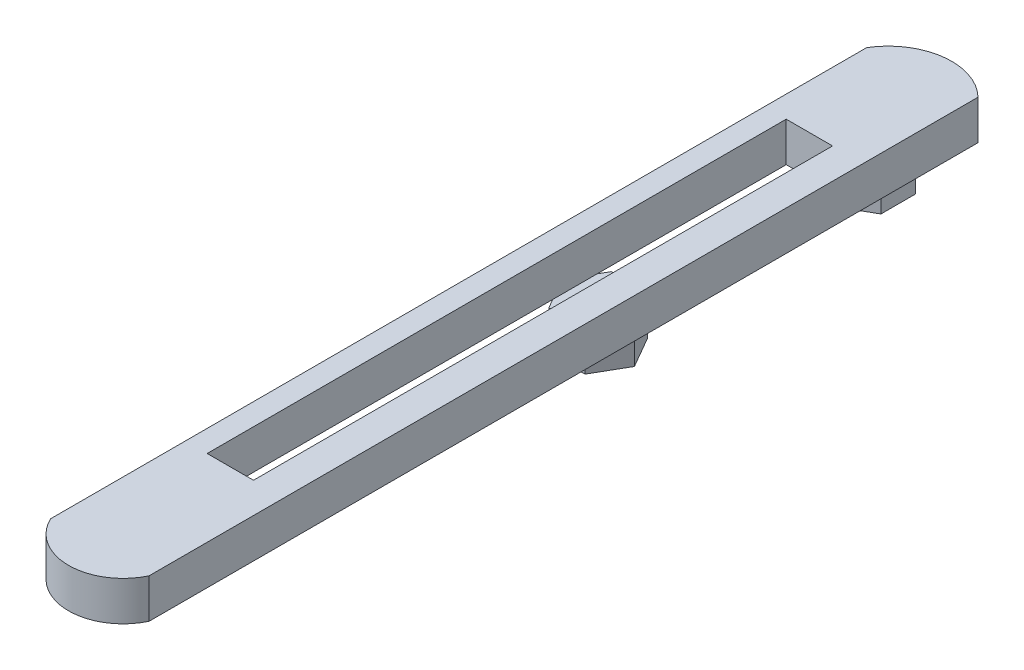
ISO-10303-21;
HEADER;
FILE_DESCRIPTION(('STEP AP214'),'2;1');
FILE_NAME('part.step','',(''),(''),'','','');
FILE_SCHEMA(('AUTOMOTIVE_DESIGN { 1 0 10303 214 1 1 1 1 }'));
ENDSEC;
DATA;
#1=APPLICATION_CONTEXT('core data for automotive mechanical design processes');
#2=APPLICATION_PROTOCOL_DEFINITION('international standard','automotive_design',2000,#1);
#3=PRODUCT_CONTEXT('',#1,'mechanical');
#4=PRODUCT('Part','Part','',(#3));
#5=PRODUCT_RELATED_PRODUCT_CATEGORY('part','',(#4));
#6=PRODUCT_DEFINITION_FORMATION('','',#4);
#7=PRODUCT_DEFINITION_CONTEXT('part definition',#1,'design');
#8=PRODUCT_DEFINITION('design','',#6,#7);
#9=PRODUCT_DEFINITION_SHAPE('','',#8);
#10=(LENGTH_UNIT() NAMED_UNIT(*) SI_UNIT(.MILLI.,.METRE.));
#11=(NAMED_UNIT(*) PLANE_ANGLE_UNIT() SI_UNIT($,.RADIAN.));
#12=(NAMED_UNIT(*) SI_UNIT($,.STERADIAN.) SOLID_ANGLE_UNIT());
#13=UNCERTAINTY_MEASURE_WITH_UNIT(LENGTH_MEASURE(1.E-05),#10,'distance_accuracy_value','');
#14=(GEOMETRIC_REPRESENTATION_CONTEXT(3) GLOBAL_UNCERTAINTY_ASSIGNED_CONTEXT((#13)) GLOBAL_UNIT_ASSIGNED_CONTEXT((#10,
#11,#12)) REPRESENTATION_CONTEXT('',''));
#15=CARTESIAN_POINT('',(0.,0.,0.));
#16=DIRECTION('',(0.,0.,1.));
#17=DIRECTION('',(1.,0.,0.));
#18=AXIS2_PLACEMENT_3D('',#15,#16,#17);
#19=CARTESIAN_POINT('',(0.,0.,0.));
#20=DIRECTION('',(0.,1.,0.));
#21=DIRECTION('',(0.,0.,1.));
#22=AXIS2_PLACEMENT_3D('',#19,#20,#21);
#23=PLANE('',#22);
#24=DIRECTION('',(0.,0.,-1.));
#25=VECTOR('',#24,1.);
#26=CARTESIAN_POINT('',(2.5,0.,0.));
#27=LINE('',#26,#25);
#28=CARTESIAN_POINT('',(2.5,0.,24.8922181093938));
#29=VERTEX_POINT('',#28);
#30=CARTESIAN_POINT('',(2.5,0.,-17.1682760320957));
#31=VERTEX_POINT('',#30);
#32=EDGE_CURVE('E299',#29,#31,#27,.T.);
#33=ORIENTED_EDGE('',*,*,#32,.F.);
#34=CARTESIAN_POINT('',(0.,0.,23.7126510164667));
#35=DIRECTION('',(0.,1.,0.));
#36=DIRECTION('',(0.,0.,1.));
#37=AXIS2_PLACEMENT_3D('',#34,#35,#36);
#38=CIRCLE('',#37,2.76430434770058);
#39=CARTESIAN_POINT('',(-2.50467081367157,0.,24.8822674672138));
#40=VERTEX_POINT('',#39);
#41=EDGE_CURVE('E304',#40,#29,#38,.T.);
#42=ORIENTED_EDGE('',*,*,#41,.F.);
#43=DIRECTION('',(0.,0.,-1.));
#44=VECTOR('',#43,1.);
#45=CARTESIAN_POINT('',(-2.50467081367156,0.,0.));
#46=LINE('',#45,#44);
#47=CARTESIAN_POINT('',(-2.50467081367156,0.,-16.525033311862));
#48=VERTEX_POINT('',#47);
#49=EDGE_CURVE('E317',#40,#48,#46,.T.);
#50=ORIENTED_EDGE('',*,*,#49,.T.);
#51=CARTESIAN_POINT('',(0.252735818204261,0.,-14.8621044000357));
#52=DIRECTION('',(0.,1.,0.));
#53=DIRECTION('',(0.,0.,1.));
#54=AXIS2_PLACEMENT_3D('',#51,#52,#53);
#55=CIRCLE('',#54,3.22003476678444);
#56=EDGE_CURVE('E314',#31,#48,#55,.T.);
#57=ORIENTED_EDGE('',*,*,#56,.F.);
#58=EDGE_LOOP('',(#33,#42,#50,#57));
#59=FACE_BOUND('',#58,.T.);
#60=DIRECTION('',(0.866025403784441,0.,-0.499999999999995));
#61=VECTOR('',#60,1.);
#62=CARTESIAN_POINT('',(-1.87937488409995,0.,-15.33627659677));
#63=LINE('',#62,#61);
#64=CARTESIAN_POINT('',(-1.87937488409995,0.,-15.33627659677));
#65=VERTEX_POINT('',#64);
#66=CARTESIAN_POINT('',(-0.354887884839172,0.,-16.2164395761693));
#67=VERTEX_POINT('',#66);
#68=EDGE_CURVE('E211',#65,#67,#63,.T.);
#69=ORIENTED_EDGE('',*,*,#68,.F.);
#70=DIRECTION('',(0.,0.,-1.));
#71=VECTOR('',#70,1.);
#72=CARTESIAN_POINT('',(-1.87937488409997,0.,-13.5759506379714));
#73=LINE('',#72,#71);
#74=CARTESIAN_POINT('',(-1.87937488409997,0.,-13.5759506379714));
#75=VERTEX_POINT('',#74);
#76=EDGE_CURVE('E221',#75,#65,#73,.T.);
#77=ORIENTED_EDGE('',*,*,#76,.F.);
#78=DIRECTION('',(-0.866025403784435,0.,-0.500000000000007));
#79=VECTOR('',#78,1.);
#80=CARTESIAN_POINT('',(-0.354887884839185,0.,-12.695787658572));
#81=LINE('',#80,#79);
#82=CARTESIAN_POINT('',(-0.354887884839185,0.,-12.695787658572));
#83=VERTEX_POINT('',#82);
#84=EDGE_CURVE('E243',#83,#75,#81,.T.);
#85=ORIENTED_EDGE('',*,*,#84,.F.);
#86=DIRECTION('',(-0.866025403784442,0.,0.499999999999995));
#87=VECTOR('',#86,1.);
#88=CARTESIAN_POINT('',(1.16959911442161,0.,-13.5759506379713));
#89=LINE('',#88,#87);
#90=CARTESIAN_POINT('',(1.16959911442161,0.,-13.5759506379713));
#91=VERTEX_POINT('',#90);
#92=EDGE_CURVE('E240',#91,#83,#89,.T.);
#93=ORIENTED_EDGE('',*,*,#92,.F.);
#94=DIRECTION('',(0.,0.,1.));
#95=VECTOR('',#94,1.);
#96=CARTESIAN_POINT('',(1.16959911442162,0.,-15.3362765967699));
#97=LINE('',#96,#95);
#98=CARTESIAN_POINT('',(1.16959911442162,0.,-15.3362765967699));
#99=VERTEX_POINT('',#98);
#100=EDGE_CURVE('E237',#99,#91,#97,.T.);
#101=ORIENTED_EDGE('',*,*,#100,.F.);
#102=DIRECTION('',(0.866025403784438,0.,0.500000000000001));
#103=VECTOR('',#102,1.);
#104=CARTESIAN_POINT('',(-0.354887884839172,0.,-16.2164395761693));
#105=LINE('',#104,#103);
#106=EDGE_CURVE('E234',#67,#99,#105,.T.);
#107=ORIENTED_EDGE('',*,*,#106,.F.);
#108=EDGE_LOOP('',(#69,#77,#85,#93,#101,#107));
#109=FACE_BOUND('',#108,.T.);
#110=DIRECTION('',(0.5,0.,0.866025403784439));
#111=VECTOR('',#110,1.);
#112=CARTESIAN_POINT('',(0.699382455431639,0.,-2.2065066920911));
#113=LINE('',#112,#111);
#114=CARTESIAN_POINT('',(0.95095692594782,0.,-1.77076692726984));
#115=VERTEX_POINT('',#114);
#116=CARTESIAN_POINT('',(1.61647764825874,0.,-0.618051222737393));
#117=VERTEX_POINT('',#116);
#118=EDGE_CURVE('E208',#115,#117,#113,.T.);
#119=ORIENTED_EDGE('',*,*,#118,.F.);
#120=DIRECTION('',(0.,0.,1.));
#121=VECTOR('',#120,1.);
#122=CARTESIAN_POINT('',(0.950956925947821,0.,18.0441080094074));
#123=LINE('',#122,#121);
#124=CARTESIAN_POINT('',(0.950956925947821,0.,-11.3375371797328));
#125=VERTEX_POINT('',#124);
#126=EDGE_CURVE('E273',#125,#115,#123,.T.);
#127=ORIENTED_EDGE('',*,*,#126,.F.);
#128=DIRECTION('',(1.,0.,0.));
#129=VECTOR('',#128,1.);
#130=CARTESIAN_POINT('',(-1.4010814219283,0.,-11.3375371797328));
#131=LINE('',#130,#129);
#132=CARTESIAN_POINT('',(-1.4010814219283,0.,-11.3375371797328));
#133=VERTEX_POINT('',#132);
#134=EDGE_CURVE('E269',#133,#125,#131,.T.);
#135=ORIENTED_EDGE('',*,*,#134,.F.);
#136=DIRECTION('',(0.,0.,-1.));
#137=VECTOR('',#136,1.);
#138=CARTESIAN_POINT('',(-1.4010814219283,0.,18.0441080094074));
#139=LINE('',#138,#137);
#140=CARTESIAN_POINT('',(-1.4010814219283,0.,-1.74530747574799));
#141=VERTEX_POINT('',#140);
#142=EDGE_CURVE('E265',#141,#133,#139,.T.);
#143=ORIENTED_EDGE('',*,*,#142,.F.);
#144=DIRECTION('',(0.5,0.,-0.866025403784439));
#145=VECTOR('',#144,1.);
#146=CARTESIAN_POINT('',(-2.05190312304966,0.,-0.618051222737392));
#147=LINE('',#146,#145);
#148=CARTESIAN_POINT('',(-2.05190312304966,0.,-0.618051222737392));
#149=VERTEX_POINT('',#148);
#150=EDGE_CURVE('E50',#149,#141,#147,.T.);
#151=ORIENTED_EDGE('',*,*,#150,.F.);
#152=DIRECTION('',(-0.5,0.,-0.866025403784439));
#153=VECTOR('',#152,1.);
#154=CARTESIAN_POINT('',(-1.13480793022256,0.,0.970404246616319));
#155=LINE('',#154,#153);
#156=CARTESIAN_POINT('',(-1.4010814219283,0.,0.509205030273207));
#157=VERTEX_POINT('',#156);
#158=EDGE_CURVE('E585',#157,#149,#155,.T.);
#159=ORIENTED_EDGE('',*,*,#158,.F.);
#160=CARTESIAN_POINT('',(-1.4010814219283,0.,18.0441080094074));
#161=VERTEX_POINT('',#160);
#162=EDGE_CURVE('E266',#161,#157,#139,.T.);
#163=ORIENTED_EDGE('',*,*,#162,.F.);
#164=DIRECTION('',(-1.,0.,0.));
#165=VECTOR('',#164,1.);
#166=CARTESIAN_POINT('',(-1.4010814219283,0.,18.0441080094074));
#167=LINE('',#166,#165);
#168=CARTESIAN_POINT('',(0.950956925947821,0.,18.0441080094074));
#169=VERTEX_POINT('',#168);
#170=EDGE_CURVE('E276',#169,#161,#167,.T.);
#171=ORIENTED_EDGE('',*,*,#170,.F.);
#172=CARTESIAN_POINT('',(0.950956925947821,0.,0.534664481795052));
#173=VERTEX_POINT('',#172);
#174=EDGE_CURVE('E272',#173,#169,#123,.T.);
#175=ORIENTED_EDGE('',*,*,#174,.F.);
#176=DIRECTION('',(-0.5,0.,0.866025403784439));
#177=VECTOR('',#176,1.);
#178=CARTESIAN_POINT('',(1.61647764825874,0.,-0.618051222737393));
#179=LINE('',#178,#177);
#180=EDGE_CURVE('E58',#117,#173,#179,.T.);
#181=ORIENTED_EDGE('',*,*,#180,.F.);
#182=EDGE_LOOP('',(#119,#127,#135,#143,#151,#159,#163,#171,#175,#181));
#183=FACE_BOUND('',#182,.T.);
#184=ADVANCED_FACE('F35',(#59,#109,#183),#23,.F.);
#185=CARTESIAN_POINT('',(2.5,2.,0.));
#186=DIRECTION('',(-1.,0.,0.));
#187=DIRECTION('',(0.,0.,1.));
#188=AXIS2_PLACEMENT_3D('',#185,#186,#187);
#189=PLANE('',#188);
#190=ORIENTED_EDGE('',*,*,#32,.T.);
#191=DIRECTION('',(0.,-1.,0.));
#192=VECTOR('',#191,1.);
#193=CARTESIAN_POINT('',(2.5,2.,-17.1682760320957));
#194=LINE('',#193,#192);
#195=CARTESIAN_POINT('',(2.5,2.,-17.1682760320957));
#196=VERTEX_POINT('',#195);
#197=EDGE_CURVE('E11',#196,#31,#194,.T.);
#198=ORIENTED_EDGE('',*,*,#197,.F.);
#199=DIRECTION('',(0.,0.,-1.));
#200=VECTOR('',#199,1.);
#201=CARTESIAN_POINT('',(2.5,2.,0.));
#202=LINE('',#201,#200);
#203=CARTESIAN_POINT('',(2.5,2.,24.8922181093938));
#204=VERTEX_POINT('',#203);
#205=EDGE_CURVE('E300',#204,#196,#202,.T.);
#206=ORIENTED_EDGE('',*,*,#205,.F.);
#207=DIRECTION('',(0.,-1.,0.));
#208=VECTOR('',#207,1.);
#209=CARTESIAN_POINT('',(2.5,2.,24.8922181093938));
#210=LINE('',#209,#208);
#211=EDGE_CURVE('E311',#204,#29,#210,.T.);
#212=ORIENTED_EDGE('',*,*,#211,.T.);
#213=EDGE_LOOP('',(#190,#198,#206,#212));
#214=FACE_BOUND('',#213,.T.);
#215=ADVANCED_FACE('F37',(#214),#189,.F.);
#216=CARTESIAN_POINT('',(0.252735818204261,2.,-14.8621044000357));
#217=DIRECTION('',(0.,-1.,0.));
#218=DIRECTION('',(0.,0.,-1.));
#219=AXIS2_PLACEMENT_3D('',#216,#217,#218);
#220=CYLINDRICAL_SURFACE('',#219,3.22003476678444);
#221=ORIENTED_EDGE('',*,*,#56,.T.);
#222=DIRECTION('',(0.,-1.,0.));
#223=VECTOR('',#222,1.);
#224=CARTESIAN_POINT('',(-2.50467081367156,2.,-16.525033311862));
#225=LINE('',#224,#223);
#226=CARTESIAN_POINT('',(-2.50467081367156,2.,-16.525033311862));
#227=VERTEX_POINT('',#226);
#228=EDGE_CURVE('E43',#227,#48,#225,.T.);
#229=ORIENTED_EDGE('',*,*,#228,.F.);
#230=CARTESIAN_POINT('',(0.252735818204261,2.,-14.8621044000357));
#231=DIRECTION('',(0.,1.,0.));
#232=DIRECTION('',(0.,0.,1.));
#233=AXIS2_PLACEMENT_3D('',#230,#231,#232);
#234=CIRCLE('',#233,3.22003476678444);
#235=EDGE_CURVE('E303',#196,#227,#234,.T.);
#236=ORIENTED_EDGE('',*,*,#235,.F.);
#237=ORIENTED_EDGE('',*,*,#197,.T.);
#238=EDGE_LOOP('',(#221,#229,#236,#237));
#239=FACE_BOUND('',#238,.T.);
#240=ADVANCED_FACE('F330',(#239),#220,.T.);
#241=CARTESIAN_POINT('',(-2.50467081367156,2.,0.));
#242=DIRECTION('',(-1.,0.,0.));
#243=DIRECTION('',(0.,0.,1.));
#244=AXIS2_PLACEMENT_3D('',#241,#242,#243);
#245=PLANE('',#244);
#246=ORIENTED_EDGE('',*,*,#49,.F.);
#247=DIRECTION('',(0.,-1.,0.));
#248=VECTOR('',#247,1.);
#249=CARTESIAN_POINT('',(-2.50467081367157,2.,24.8822674672138));
#250=LINE('',#249,#248);
#251=CARTESIAN_POINT('',(-2.50467081367157,2.,24.8822674672138));
#252=VERTEX_POINT('',#251);
#253=EDGE_CURVE('E323',#252,#40,#250,.T.);
#254=ORIENTED_EDGE('',*,*,#253,.F.);
#255=DIRECTION('',(0.,0.,-1.));
#256=VECTOR('',#255,1.);
#257=CARTESIAN_POINT('',(-2.50467081367156,2.,0.));
#258=LINE('',#257,#256);
#259=EDGE_CURVE('E306',#252,#227,#258,.T.);
#260=ORIENTED_EDGE('',*,*,#259,.T.);
#261=ORIENTED_EDGE('',*,*,#228,.T.);
#262=EDGE_LOOP('',(#246,#254,#260,#261));
#263=FACE_BOUND('',#262,.T.);
#264=ADVANCED_FACE('F327',(#263),#245,.T.);
#265=CARTESIAN_POINT('',(0.,2.,23.7126510164667));
#266=DIRECTION('',(0.,-1.,0.));
#267=DIRECTION('',(0.,0.,-1.));
#268=AXIS2_PLACEMENT_3D('',#265,#266,#267);
#269=CYLINDRICAL_SURFACE('',#268,2.76430434770058);
#270=ORIENTED_EDGE('',*,*,#41,.T.);
#271=ORIENTED_EDGE('',*,*,#211,.F.);
#272=CARTESIAN_POINT('',(0.,2.,23.7126510164667));
#273=DIRECTION('',(0.,1.,0.));
#274=DIRECTION('',(0.,0.,1.));
#275=AXIS2_PLACEMENT_3D('',#272,#273,#274);
#276=CIRCLE('',#275,2.76430434770058);
#277=EDGE_CURVE('E309',#252,#204,#276,.T.);
#278=ORIENTED_EDGE('',*,*,#277,.F.);
#279=ORIENTED_EDGE('',*,*,#253,.T.);
#280=EDGE_LOOP('',(#270,#271,#278,#279));
#281=FACE_BOUND('',#280,.T.);
#282=ADVANCED_FACE('F338',(#281),#269,.T.);
#283=CARTESIAN_POINT('',(0.,2.,0.));
#284=DIRECTION('',(0.,1.,0.));
#285=DIRECTION('',(0.,0.,1.));
#286=AXIS2_PLACEMENT_3D('',#283,#284,#285);
#287=PLANE('',#286);
#288=DIRECTION('',(0.,0.,1.));
#289=VECTOR('',#288,1.);
#290=CARTESIAN_POINT('',(-1.4010814219283,2.,0.));
#291=LINE('',#290,#289);
#292=CARTESIAN_POINT('',(-1.4010814219283,2.,-11.3375371797328));
#293=VERTEX_POINT('',#292);
#294=CARTESIAN_POINT('',(-1.4010814219283,2.,18.0441080094074));
#295=VERTEX_POINT('',#294);
#296=EDGE_CURVE('E297',#293,#295,#291,.T.);
#297=ORIENTED_EDGE('',*,*,#296,.F.);
#298=DIRECTION('',(-1.,0.,0.));
#299=VECTOR('',#298,1.);
#300=CARTESIAN_POINT('',(0.,2.,-11.3375371797328));
#301=LINE('',#300,#299);
#302=CARTESIAN_POINT('',(0.950956925947821,2.,-11.3375371797328));
#303=VERTEX_POINT('',#302);
#304=EDGE_CURVE('E283',#303,#293,#301,.T.);
#305=ORIENTED_EDGE('',*,*,#304,.F.);
#306=DIRECTION('',(0.,0.,-1.));
#307=VECTOR('',#306,1.);
#308=CARTESIAN_POINT('',(0.950956925947821,2.,0.));
#309=LINE('',#308,#307);
#310=CARTESIAN_POINT('',(0.950956925947821,2.,18.0441080094074));
#311=VERTEX_POINT('',#310);
#312=EDGE_CURVE('E292',#311,#303,#309,.T.);
#313=ORIENTED_EDGE('',*,*,#312,.F.);
#314=DIRECTION('',(1.,0.,0.));
#315=VECTOR('',#314,1.);
#316=CARTESIAN_POINT('',(0.,2.,18.0441080094074));
#317=LINE('',#316,#315);
#318=EDGE_CURVE('E295',#295,#311,#317,.T.);
#319=ORIENTED_EDGE('',*,*,#318,.F.);
#320=EDGE_LOOP('',(#297,#305,#313,#319));
#321=FACE_BOUND('',#320,.T.);
#322=ORIENTED_EDGE('',*,*,#205,.T.);
#323=ORIENTED_EDGE('',*,*,#235,.T.);
#324=ORIENTED_EDGE('',*,*,#259,.F.);
#325=ORIENTED_EDGE('',*,*,#277,.T.);
#326=EDGE_LOOP('',(#322,#323,#324,#325));
#327=FACE_BOUND('',#326,.T.);
#328=ADVANCED_FACE('F343',(#321,#327),#287,.T.);
#329=CARTESIAN_POINT('',(-1.4010814219283,10.,18.0441080094074));
#330=DIRECTION('',(-1.,0.,0.));
#331=DIRECTION('',(0.,0.,1.));
#332=AXIS2_PLACEMENT_3D('',#329,#330,#331);
#333=PLANE('',#332);
#334=ORIENTED_EDGE('',*,*,#296,.T.);
#335=DIRECTION('',(0.,-1.,0.));
#336=VECTOR('',#335,1.);
#337=CARTESIAN_POINT('',(-1.4010814219283,10.,18.0441080094074));
#338=LINE('',#337,#336);
#339=EDGE_CURVE('E281',#295,#161,#338,.T.);
#340=ORIENTED_EDGE('',*,*,#339,.T.);
#341=ORIENTED_EDGE('',*,*,#162,.T.);
#342=DIRECTION('',(0.,0.,1.));
#343=VECTOR('',#342,1.);
#344=CARTESIAN_POINT('',(-1.4010814219283,0.,18.0441080094074));
#345=LINE('',#344,#343);
#346=EDGE_CURVE('E209',#141,#157,#345,.T.);
#347=ORIENTED_EDGE('',*,*,#346,.F.);
#348=ORIENTED_EDGE('',*,*,#142,.T.);
#349=DIRECTION('',(0.,-1.,0.));
#350=VECTOR('',#349,1.);
#351=CARTESIAN_POINT('',(-1.4010814219283,10.,-11.3375371797328));
#352=LINE('',#351,#350);
#353=EDGE_CURVE('E280',#293,#133,#352,.T.);
#354=ORIENTED_EDGE('',*,*,#353,.F.);
#355=EDGE_LOOP('',(#334,#340,#341,#347,#348,#354));
#356=FACE_BOUND('',#355,.T.);
#357=ADVANCED_FACE('F345',(#356),#333,.F.);
#358=CARTESIAN_POINT('',(-1.4010814219283,10.,18.0441080094074));
#359=DIRECTION('',(0.,0.,1.));
#360=DIRECTION('',(1.,0.,0.));
#361=AXIS2_PLACEMENT_3D('',#358,#359,#360);
#362=PLANE('',#361);
#363=ORIENTED_EDGE('',*,*,#318,.T.);
#364=DIRECTION('',(0.,-1.,0.));
#365=VECTOR('',#364,1.);
#366=CARTESIAN_POINT('',(0.950956925947821,10.,18.0441080094074));
#367=LINE('',#366,#365);
#368=EDGE_CURVE('E284',#311,#169,#367,.T.);
#369=ORIENTED_EDGE('',*,*,#368,.T.);
#370=ORIENTED_EDGE('',*,*,#170,.T.);
#371=ORIENTED_EDGE('',*,*,#339,.F.);
#372=EDGE_LOOP('',(#363,#369,#370,#371));
#373=FACE_BOUND('',#372,.T.);
#374=ADVANCED_FACE('F352',(#373),#362,.F.);
#375=CARTESIAN_POINT('',(0.950956925947821,10.,18.0441080094074));
#376=DIRECTION('',(1.,0.,0.));
#377=DIRECTION('',(0.,0.,-1.));
#378=AXIS2_PLACEMENT_3D('',#375,#376,#377);
#379=PLANE('',#378);
#380=ORIENTED_EDGE('',*,*,#312,.T.);
#381=DIRECTION('',(0.,-1.,0.));
#382=VECTOR('',#381,1.);
#383=CARTESIAN_POINT('',(0.950956925947821,10.,-11.3375371797328));
#384=LINE('',#383,#382);
#385=EDGE_CURVE('E287',#303,#125,#384,.T.);
#386=ORIENTED_EDGE('',*,*,#385,.T.);
#387=ORIENTED_EDGE('',*,*,#126,.T.);
#388=EDGE_CURVE('E277',#115,#173,#123,.T.);
#389=ORIENTED_EDGE('',*,*,#388,.T.);
#390=ORIENTED_EDGE('',*,*,#174,.T.);
#391=ORIENTED_EDGE('',*,*,#368,.F.);
#392=EDGE_LOOP('',(#380,#386,#387,#389,#390,#391));
#393=FACE_BOUND('',#392,.T.);
#394=ADVANCED_FACE('F391',(#393),#379,.F.);
#395=CARTESIAN_POINT('',(-1.4010814219283,10.,-11.3375371797328));
#396=DIRECTION('',(0.,0.,-1.));
#397=DIRECTION('',(-1.,0.,0.));
#398=AXIS2_PLACEMENT_3D('',#395,#396,#397);
#399=PLANE('',#398);
#400=ORIENTED_EDGE('',*,*,#304,.T.);
#401=ORIENTED_EDGE('',*,*,#353,.T.);
#402=ORIENTED_EDGE('',*,*,#134,.T.);
#403=ORIENTED_EDGE('',*,*,#385,.F.);
#404=EDGE_LOOP('',(#400,#401,#402,#403));
#405=FACE_BOUND('',#404,.T.);
#406=ADVANCED_FACE('F399',(#405),#399,.F.);
#407=CARTESIAN_POINT('',(-1.87937488409995,-2.,-15.33627659677));
#408=DIRECTION('',(0.499999999999995,0.,0.866025403784441));
#409=DIRECTION('',(0.866025403784441,0.,-0.499999999999995));
#410=AXIS2_PLACEMENT_3D('',#407,#408,#409);
#411=PLANE('',#410);
#412=ORIENTED_EDGE('',*,*,#68,.T.);
#413=DIRECTION('',(0.,1.,0.));
#414=VECTOR('',#413,1.);
#415=CARTESIAN_POINT('',(-0.354887884839172,-2.,-16.2164395761693));
#416=LINE('',#415,#414);
#417=CARTESIAN_POINT('',(-0.354887884839172,-2.,-16.2164395761693));
#418=VERTEX_POINT('',#417);
#419=EDGE_CURVE('E262',#418,#67,#416,.T.);
#420=ORIENTED_EDGE('',*,*,#419,.F.);
#421=DIRECTION('',(0.866025403784441,0.,-0.499999999999995));
#422=VECTOR('',#421,1.);
#423=CARTESIAN_POINT('',(-1.87937488409995,-2.,-15.33627659677));
#424=LINE('',#423,#422);
#425=CARTESIAN_POINT('',(-1.87937488409995,-2.,-15.33627659677));
#426=VERTEX_POINT('',#425);
#427=EDGE_CURVE('E217',#426,#418,#424,.T.);
#428=ORIENTED_EDGE('',*,*,#427,.F.);
#429=DIRECTION('',(0.,1.,0.));
#430=VECTOR('',#429,1.);
#431=CARTESIAN_POINT('',(-1.87937488409995,-2.,-15.33627659677));
#432=LINE('',#431,#430);
#433=EDGE_CURVE('E231',#426,#65,#432,.T.);
#434=ORIENTED_EDGE('',*,*,#433,.T.);
#435=EDGE_LOOP('',(#412,#420,#428,#434));
#436=FACE_BOUND('',#435,.T.);
#437=ADVANCED_FACE('F404',(#436),#411,.F.);
#438=CARTESIAN_POINT('',(-0.354887884839172,-2.,-16.2164395761693));
#439=DIRECTION('',(-0.500000000000001,0.,0.866025403784438));
#440=DIRECTION('',(0.866025403784438,0.,0.500000000000001));
#441=AXIS2_PLACEMENT_3D('',#438,#439,#440);
#442=PLANE('',#441);
#443=ORIENTED_EDGE('',*,*,#106,.T.);
#444=DIRECTION('',(0.,1.,0.));
#445=VECTOR('',#444,1.);
#446=CARTESIAN_POINT('',(1.16959911442162,-2.,-15.3362765967699));
#447=LINE('',#446,#445);
#448=CARTESIAN_POINT('',(1.16959911442162,-2.,-15.3362765967699));
#449=VERTEX_POINT('',#448);
#450=EDGE_CURVE('E259',#449,#99,#447,.T.);
#451=ORIENTED_EDGE('',*,*,#450,.F.);
#452=DIRECTION('',(0.866025403784438,0.,0.500000000000001));
#453=VECTOR('',#452,1.);
#454=CARTESIAN_POINT('',(-0.354887884839172,-2.,-16.2164395761693));
#455=LINE('',#454,#453);
#456=EDGE_CURVE('E220',#418,#449,#455,.T.);
#457=ORIENTED_EDGE('',*,*,#456,.F.);
#458=ORIENTED_EDGE('',*,*,#419,.T.);
#459=EDGE_LOOP('',(#443,#451,#457,#458));
#460=FACE_BOUND('',#459,.T.);
#461=ADVANCED_FACE('F414',(#460),#442,.F.);
#462=CARTESIAN_POINT('',(1.16959911442162,-2.,-15.3362765967699));
#463=DIRECTION('',(-1.,0.,0.));
#464=DIRECTION('',(0.,0.,1.));
#465=AXIS2_PLACEMENT_3D('',#462,#463,#464);
#466=PLANE('',#465);
#467=ORIENTED_EDGE('',*,*,#100,.T.);
#468=DIRECTION('',(0.,1.,0.));
#469=VECTOR('',#468,1.);
#470=CARTESIAN_POINT('',(1.16959911442161,-2.,-13.5759506379713));
#471=LINE('',#470,#469);
#472=CARTESIAN_POINT('',(1.16959911442161,-2.,-13.5759506379713));
#473=VERTEX_POINT('',#472);
#474=EDGE_CURVE('E256',#473,#91,#471,.T.);
#475=ORIENTED_EDGE('',*,*,#474,.F.);
#476=DIRECTION('',(0.,0.,1.));
#477=VECTOR('',#476,1.);
#478=CARTESIAN_POINT('',(1.16959911442162,-2.,-15.3362765967699));
#479=LINE('',#478,#477);
#480=EDGE_CURVE('E223',#449,#473,#479,.T.);
#481=ORIENTED_EDGE('',*,*,#480,.F.);
#482=ORIENTED_EDGE('',*,*,#450,.T.);
#483=EDGE_LOOP('',(#467,#475,#481,#482));
#484=FACE_BOUND('',#483,.T.);
#485=ADVANCED_FACE('F424',(#484),#466,.F.);
#486=CARTESIAN_POINT('',(1.16959911442161,-2.,-13.5759506379713));
#487=DIRECTION('',(-0.499999999999995,0.,-0.866025403784442));
#488=DIRECTION('',(-0.866025403784442,0.,0.499999999999995));
#489=AXIS2_PLACEMENT_3D('',#486,#487,#488);
#490=PLANE('',#489);
#491=ORIENTED_EDGE('',*,*,#92,.T.);
#492=DIRECTION('',(0.,1.,0.));
#493=VECTOR('',#492,1.);
#494=CARTESIAN_POINT('',(-0.354887884839185,-2.,-12.695787658572));
#495=LINE('',#494,#493);
#496=CARTESIAN_POINT('',(-0.354887884839185,-2.,-12.695787658572));
#497=VERTEX_POINT('',#496);
#498=EDGE_CURVE('E253',#497,#83,#495,.T.);
#499=ORIENTED_EDGE('',*,*,#498,.F.);
#500=DIRECTION('',(-0.866025403784442,0.,0.499999999999995));
#501=VECTOR('',#500,1.);
#502=CARTESIAN_POINT('',(1.16959911442161,-2.,-13.5759506379713));
#503=LINE('',#502,#501);
#504=EDGE_CURVE('E225',#473,#497,#503,.T.);
#505=ORIENTED_EDGE('',*,*,#504,.F.);
#506=ORIENTED_EDGE('',*,*,#474,.T.);
#507=EDGE_LOOP('',(#491,#499,#505,#506));
#508=FACE_BOUND('',#507,.T.);
#509=ADVANCED_FACE('F434',(#508),#490,.F.);
#510=CARTESIAN_POINT('',(-0.354887884839185,-2.,-12.695787658572));
#511=DIRECTION('',(0.500000000000007,0.,-0.866025403784435));
#512=DIRECTION('',(-0.866025403784435,0.,-0.500000000000007));
#513=AXIS2_PLACEMENT_3D('',#510,#511,#512);
#514=PLANE('',#513);
#515=ORIENTED_EDGE('',*,*,#84,.T.);
#516=DIRECTION('',(0.,1.,0.));
#517=VECTOR('',#516,1.);
#518=CARTESIAN_POINT('',(-1.87937488409997,-2.,-13.5759506379714));
#519=LINE('',#518,#517);
#520=CARTESIAN_POINT('',(-1.87937488409997,-2.,-13.5759506379714));
#521=VERTEX_POINT('',#520);
#522=EDGE_CURVE('E250',#521,#75,#519,.T.);
#523=ORIENTED_EDGE('',*,*,#522,.F.);
#524=DIRECTION('',(-0.866025403784435,0.,-0.500000000000007));
#525=VECTOR('',#524,1.);
#526=CARTESIAN_POINT('',(-0.354887884839185,-2.,-12.695787658572));
#527=LINE('',#526,#525);
#528=EDGE_CURVE('E227',#497,#521,#527,.T.);
#529=ORIENTED_EDGE('',*,*,#528,.F.);
#530=ORIENTED_EDGE('',*,*,#498,.T.);
#531=EDGE_LOOP('',(#515,#523,#529,#530));
#532=FACE_BOUND('',#531,.T.);
#533=ADVANCED_FACE('F444',(#532),#514,.F.);
#534=CARTESIAN_POINT('',(-1.87937488409997,-2.,-13.5759506379714));
#535=DIRECTION('',(1.,0.,0.));
#536=DIRECTION('',(0.,0.,-1.));
#537=AXIS2_PLACEMENT_3D('',#534,#535,#536);
#538=PLANE('',#537);
#539=ORIENTED_EDGE('',*,*,#76,.T.);
#540=ORIENTED_EDGE('',*,*,#433,.F.);
#541=DIRECTION('',(0.,0.,-1.));
#542=VECTOR('',#541,1.);
#543=CARTESIAN_POINT('',(-1.87937488409997,-2.,-13.5759506379714));
#544=LINE('',#543,#542);
#545=EDGE_CURVE('E229',#521,#426,#544,.T.);
#546=ORIENTED_EDGE('',*,*,#545,.F.);
#547=ORIENTED_EDGE('',*,*,#522,.T.);
#548=EDGE_LOOP('',(#539,#540,#546,#547));
#549=FACE_BOUND('',#548,.T.);
#550=ADVANCED_FACE('F454',(#549),#538,.F.);
#551=CARTESIAN_POINT('',(0.,-2.,0.));
#552=DIRECTION('',(0.,-1.,0.));
#553=DIRECTION('',(0.,0.,-1.));
#554=AXIS2_PLACEMENT_3D('',#551,#552,#553);
#555=PLANE('',#554);
#556=ORIENTED_EDGE('',*,*,#427,.T.);
#557=ORIENTED_EDGE('',*,*,#456,.T.);
#558=ORIENTED_EDGE('',*,*,#480,.T.);
#559=ORIENTED_EDGE('',*,*,#504,.T.);
#560=ORIENTED_EDGE('',*,*,#528,.T.);
#561=ORIENTED_EDGE('',*,*,#545,.T.);
#562=EDGE_LOOP('',(#556,#557,#558,#559,#560,#561));
#563=FACE_BOUND('',#562,.T.);
#564=ADVANCED_FACE('F464',(#563),#555,.T.);
#565=CARTESIAN_POINT('',(0.,0.,0.));
#566=DIRECTION('',(0.,-1.,0.));
#567=DIRECTION('',(0.,0.,-1.));
#568=AXIS2_PLACEMENT_3D('',#565,#566,#567);
#569=PLANE('',#568);
#570=CARTESIAN_POINT('',(-1.13480793022256,0.,-2.2065066920911));
#571=VERTEX_POINT('',#570);
#572=EDGE_CURVE('E589',#141,#571,#147,.T.);
#573=ORIENTED_EDGE('',*,*,#572,.F.);
#574=ORIENTED_EDGE('',*,*,#346,.T.);
#575=CARTESIAN_POINT('',(-1.13480793022256,0.,0.970404246616319));
#576=VERTEX_POINT('',#575);
#577=EDGE_CURVE('E586',#576,#157,#155,.T.);
#578=ORIENTED_EDGE('',*,*,#577,.F.);
#579=DIRECTION('',(-1.,0.,0.));
#580=VECTOR('',#579,1.);
#581=CARTESIAN_POINT('',(0.69938245543164,0.,0.970404246616318));
#582=LINE('',#581,#580);
#583=CARTESIAN_POINT('',(0.69938245543164,0.,0.970404246616318));
#584=VERTEX_POINT('',#583);
#585=EDGE_CURVE('E583',#584,#576,#582,.T.);
#586=ORIENTED_EDGE('',*,*,#585,.F.);
#587=EDGE_CURVE('E577',#173,#584,#179,.T.);
#588=ORIENTED_EDGE('',*,*,#587,.F.);
#589=ORIENTED_EDGE('',*,*,#388,.F.);
#590=CARTESIAN_POINT('',(0.699382455431639,0.,-2.2065066920911));
#591=VERTEX_POINT('',#590);
#592=EDGE_CURVE('E574',#591,#115,#113,.T.);
#593=ORIENTED_EDGE('',*,*,#592,.F.);
#594=DIRECTION('',(1.,0.,0.));
#595=VECTOR('',#594,1.);
#596=CARTESIAN_POINT('',(-1.13480793022256,0.,-2.2065066920911));
#597=LINE('',#596,#595);
#598=EDGE_CURVE('E203',#571,#591,#597,.T.);
#599=ORIENTED_EDGE('',*,*,#598,.F.);
#600=EDGE_LOOP('',(#573,#574,#578,#586,#588,#589,#593,#599));
#601=FACE_BOUND('',#600,.T.);
#602=ADVANCED_FACE('F473',(#601),#569,.F.);
#603=CARTESIAN_POINT('',(0.699382455431639,-2.,-2.2065066920911));
#604=DIRECTION('',(-0.866025403784439,0.,0.5));
#605=DIRECTION('',(0.5,0.,0.866025403784439));
#606=AXIS2_PLACEMENT_3D('',#603,#604,#605);
#607=PLANE('',#606);
#608=ORIENTED_EDGE('',*,*,#592,.T.);
#609=ORIENTED_EDGE('',*,*,#118,.T.);
#610=DIRECTION('',(0.,1.,0.));
#611=VECTOR('',#610,1.);
#612=CARTESIAN_POINT('',(1.61647764825874,-2.,-0.618051222737393));
#613=LINE('',#612,#611);
#614=CARTESIAN_POINT('',(1.61647764825874,-2.,-0.618051222737393));
#615=VERTEX_POINT('',#614);
#616=EDGE_CURVE('E188',#615,#117,#613,.T.);
#617=ORIENTED_EDGE('',*,*,#616,.F.);
#618=DIRECTION('',(0.5,0.,0.866025403784439));
#619=VECTOR('',#618,1.);
#620=CARTESIAN_POINT('',(0.699382455431639,-2.,-2.2065066920911));
#621=LINE('',#620,#619);
#622=CARTESIAN_POINT('',(0.699382455431639,-2.,-2.2065066920911));
#623=VERTEX_POINT('',#622);
#624=EDGE_CURVE('E194',#623,#615,#621,.T.);
#625=ORIENTED_EDGE('',*,*,#624,.F.);
#626=DIRECTION('',(0.,1.,0.));
#627=VECTOR('',#626,1.);
#628=CARTESIAN_POINT('',(0.699382455431639,-2.,-2.2065066920911));
#629=LINE('',#628,#627);
#630=EDGE_CURVE('E569',#623,#591,#629,.T.);
#631=ORIENTED_EDGE('',*,*,#630,.T.);
#632=EDGE_LOOP('',(#608,#609,#617,#625,#631));
#633=FACE_BOUND('',#632,.T.);
#634=ADVANCED_FACE('F206',(#633),#607,.F.);
#635=CARTESIAN_POINT('',(1.61647764825874,-2.,-0.618051222737393));
#636=DIRECTION('',(-0.866025403784439,0.,-0.5));
#637=DIRECTION('',(-0.5,0.,0.866025403784439));
#638=AXIS2_PLACEMENT_3D('',#635,#636,#637);
#639=PLANE('',#638);
#640=ORIENTED_EDGE('',*,*,#180,.T.);
#641=ORIENTED_EDGE('',*,*,#587,.T.);
#642=DIRECTION('',(0.,1.,0.));
#643=VECTOR('',#642,1.);
#644=CARTESIAN_POINT('',(0.69938245543164,-2.,0.970404246616318));
#645=LINE('',#644,#643);
#646=CARTESIAN_POINT('',(0.69938245543164,-2.,0.970404246616318));
#647=VERTEX_POINT('',#646);
#648=EDGE_CURVE('E190',#647,#584,#645,.T.);
#649=ORIENTED_EDGE('',*,*,#648,.F.);
#650=DIRECTION('',(-0.5,0.,0.866025403784439));
#651=VECTOR('',#650,1.);
#652=CARTESIAN_POINT('',(1.61647764825874,-2.,-0.618051222737393));
#653=LINE('',#652,#651);
#654=EDGE_CURVE('E184',#615,#647,#653,.T.);
#655=ORIENTED_EDGE('',*,*,#654,.F.);
#656=ORIENTED_EDGE('',*,*,#616,.T.);
#657=EDGE_LOOP('',(#640,#641,#649,#655,#656));
#658=FACE_BOUND('',#657,.T.);
#659=ADVANCED_FACE('F186',(#658),#639,.F.);
#660=CARTESIAN_POINT('',(0.69938245543164,-2.,0.970404246616318));
#661=DIRECTION('',(0.,0.,-1.));
#662=DIRECTION('',(-1.,0.,0.));
#663=AXIS2_PLACEMENT_3D('',#660,#661,#662);
#664=PLANE('',#663);
#665=ORIENTED_EDGE('',*,*,#585,.T.);
#666=DIRECTION('',(0.,1.,0.));
#667=VECTOR('',#666,1.);
#668=CARTESIAN_POINT('',(-1.13480793022256,-2.,0.970404246616319));
#669=LINE('',#668,#667);
#670=CARTESIAN_POINT('',(-1.13480793022256,-2.,0.970404246616319));
#671=VERTEX_POINT('',#670);
#672=EDGE_CURVE('E213',#671,#576,#669,.T.);
#673=ORIENTED_EDGE('',*,*,#672,.F.);
#674=DIRECTION('',(-1.,0.,0.));
#675=VECTOR('',#674,1.);
#676=CARTESIAN_POINT('',(0.69938245543164,-2.,0.970404246616318));
#677=LINE('',#676,#675);
#678=EDGE_CURVE('E193',#647,#671,#677,.T.);
#679=ORIENTED_EDGE('',*,*,#678,.F.);
#680=ORIENTED_EDGE('',*,*,#648,.T.);
#681=EDGE_LOOP('',(#665,#673,#679,#680));
#682=FACE_BOUND('',#681,.T.);
#683=ADVANCED_FACE('F517',(#682),#664,.F.);
#684=CARTESIAN_POINT('',(-1.13480793022256,-2.,0.970404246616319));
#685=DIRECTION('',(0.866025403784439,0.,-0.5));
#686=DIRECTION('',(-0.5,0.,-0.866025403784439));
#687=AXIS2_PLACEMENT_3D('',#684,#685,#686);
#688=PLANE('',#687);
#689=ORIENTED_EDGE('',*,*,#577,.T.);
#690=ORIENTED_EDGE('',*,*,#158,.T.);
#691=DIRECTION('',(0.,1.,0.));
#692=VECTOR('',#691,1.);
#693=CARTESIAN_POINT('',(-2.05190312304966,-2.,-0.618051222737392));
#694=LINE('',#693,#692);
#695=CARTESIAN_POINT('',(-2.05190312304966,-2.,-0.618051222737392));
#696=VERTEX_POINT('',#695);
#697=EDGE_CURVE('E592',#696,#149,#694,.T.);
#698=ORIENTED_EDGE('',*,*,#697,.F.);
#699=DIRECTION('',(-0.5,0.,-0.866025403784439));
#700=VECTOR('',#699,1.);
#701=CARTESIAN_POINT('',(-1.13480793022256,-2.,0.970404246616319));
#702=LINE('',#701,#700);
#703=EDGE_CURVE('E599',#671,#696,#702,.T.);
#704=ORIENTED_EDGE('',*,*,#703,.F.);
#705=ORIENTED_EDGE('',*,*,#672,.T.);
#706=EDGE_LOOP('',(#689,#690,#698,#704,#705));
#707=FACE_BOUND('',#706,.T.);
#708=ADVANCED_FACE('F526',(#707),#688,.F.);
#709=CARTESIAN_POINT('',(-2.05190312304966,-2.,-0.618051222737392));
#710=DIRECTION('',(0.866025403784439,0.,0.5));
#711=DIRECTION('',(0.5,0.,-0.866025403784439));
#712=AXIS2_PLACEMENT_3D('',#709,#710,#711);
#713=PLANE('',#712);
#714=ORIENTED_EDGE('',*,*,#150,.T.);
#715=ORIENTED_EDGE('',*,*,#572,.T.);
#716=DIRECTION('',(0.,1.,0.));
#717=VECTOR('',#716,1.);
#718=CARTESIAN_POINT('',(-1.13480793022256,-2.,-2.2065066920911));
#719=LINE('',#718,#717);
#720=CARTESIAN_POINT('',(-1.13480793022256,-2.,-2.2065066920911));
#721=VERTEX_POINT('',#720);
#722=EDGE_CURVE('E571',#721,#571,#719,.T.);
#723=ORIENTED_EDGE('',*,*,#722,.F.);
#724=DIRECTION('',(0.5,0.,-0.866025403784439));
#725=VECTOR('',#724,1.);
#726=CARTESIAN_POINT('',(-2.05190312304966,-2.,-0.618051222737392));
#727=LINE('',#726,#725);
#728=EDGE_CURVE('E610',#696,#721,#727,.T.);
#729=ORIENTED_EDGE('',*,*,#728,.F.);
#730=ORIENTED_EDGE('',*,*,#697,.T.);
#731=EDGE_LOOP('',(#714,#715,#723,#729,#730));
#732=FACE_BOUND('',#731,.T.);
#733=ADVANCED_FACE('F536',(#732),#713,.F.);
#734=CARTESIAN_POINT('',(-1.13480793022256,-2.,-2.2065066920911));
#735=DIRECTION('',(0.,0.,1.));
#736=DIRECTION('',(1.,0.,0.));
#737=AXIS2_PLACEMENT_3D('',#734,#735,#736);
#738=PLANE('',#737);
#739=ORIENTED_EDGE('',*,*,#598,.T.);
#740=ORIENTED_EDGE('',*,*,#630,.F.);
#741=DIRECTION('',(1.,0.,0.));
#742=VECTOR('',#741,1.);
#743=CARTESIAN_POINT('',(-1.13480793022256,-2.,-2.2065066920911));
#744=LINE('',#743,#742);
#745=EDGE_CURVE('E199',#721,#623,#744,.T.);
#746=ORIENTED_EDGE('',*,*,#745,.F.);
#747=ORIENTED_EDGE('',*,*,#722,.T.);
#748=EDGE_LOOP('',(#739,#740,#746,#747));
#749=FACE_BOUND('',#748,.T.);
#750=ADVANCED_FACE('F546',(#749),#738,.F.);
#751=CARTESIAN_POINT('',(0.,-2.,0.));
#752=DIRECTION('',(0.,-1.,0.));
#753=DIRECTION('',(0.,0.,-1.));
#754=AXIS2_PLACEMENT_3D('',#751,#752,#753);
#755=PLANE('',#754);
#756=ORIENTED_EDGE('',*,*,#624,.T.);
#757=ORIENTED_EDGE('',*,*,#654,.T.);
#758=ORIENTED_EDGE('',*,*,#678,.T.);
#759=ORIENTED_EDGE('',*,*,#703,.T.);
#760=ORIENTED_EDGE('',*,*,#728,.T.);
#761=ORIENTED_EDGE('',*,*,#745,.T.);
#762=EDGE_LOOP('',(#756,#757,#758,#759,#760,#761));
#763=FACE_BOUND('',#762,.T.);
#764=ADVANCED_FACE('F197',(#763),#755,.T.);
#765=CLOSED_SHELL('',(#184,#215,#240,#264,#282,#328,#357,#374,#394,#406,#437,#461,#485,#509,
#533,#550,#564,#602,#634,#659,#683,#708,#733,#750,#764));
#766=MANIFOLD_SOLID_BREP('B2',#765);
#767=ADVANCED_BREP_SHAPE_REPRESENTATION('',(#18,#766),#14);
#768=SHAPE_DEFINITION_REPRESENTATION(#9,#767);
ENDSEC;
END-ISO-10303-21;
